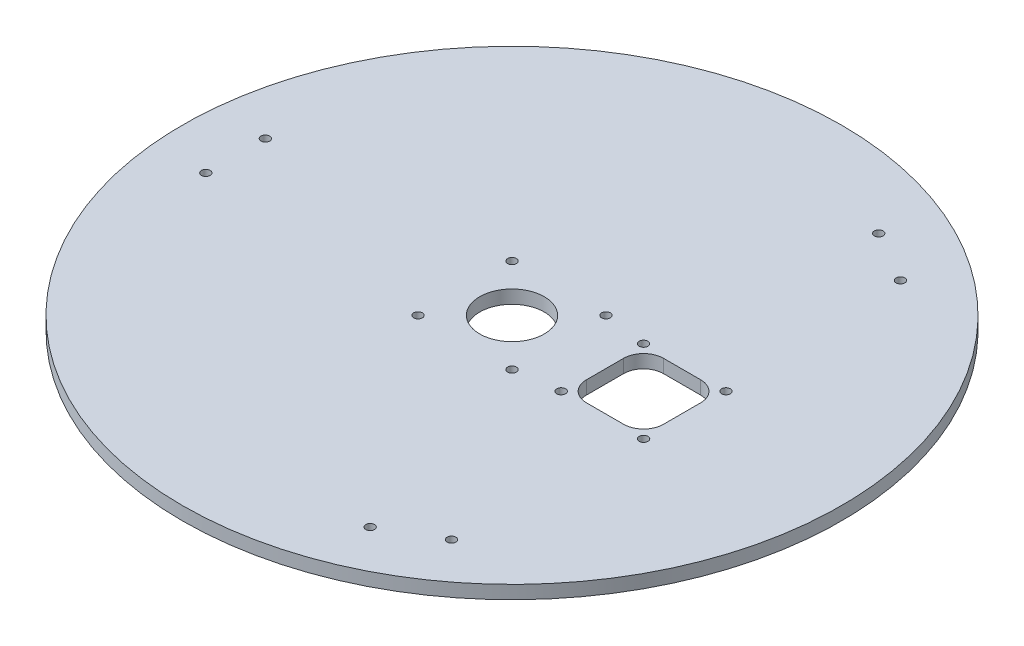
ISO-10303-21;
HEADER;
FILE_DESCRIPTION(('STEP AP214'),'2;1');
FILE_NAME('part.step','',(''),(''),'','','');
FILE_SCHEMA(('AUTOMOTIVE_DESIGN { 1 0 10303 214 1 1 1 1 }'));
ENDSEC;
DATA;
#1=APPLICATION_CONTEXT('core data for automotive mechanical design processes');
#2=APPLICATION_PROTOCOL_DEFINITION('international standard','automotive_design',2000,#1);
#3=PRODUCT_CONTEXT('',#1,'mechanical');
#4=PRODUCT('Part','Part','',(#3));
#5=PRODUCT_RELATED_PRODUCT_CATEGORY('part','',(#4));
#6=PRODUCT_DEFINITION_FORMATION('','',#4);
#7=PRODUCT_DEFINITION_CONTEXT('part definition',#1,'design');
#8=PRODUCT_DEFINITION('design','',#6,#7);
#9=PRODUCT_DEFINITION_SHAPE('','',#8);
#10=(LENGTH_UNIT() NAMED_UNIT(*) SI_UNIT(.MILLI.,.METRE.));
#11=(NAMED_UNIT(*) PLANE_ANGLE_UNIT() SI_UNIT($,.RADIAN.));
#12=(NAMED_UNIT(*) SI_UNIT($,.STERADIAN.) SOLID_ANGLE_UNIT());
#13=UNCERTAINTY_MEASURE_WITH_UNIT(LENGTH_MEASURE(1.E-05),#10,'distance_accuracy_value','');
#14=(GEOMETRIC_REPRESENTATION_CONTEXT(3) GLOBAL_UNCERTAINTY_ASSIGNED_CONTEXT((#13)) GLOBAL_UNIT_ASSIGNED_CONTEXT((#10,
#11,#12)) REPRESENTATION_CONTEXT('',''));
#15=CARTESIAN_POINT('',(0.,0.,0.));
#16=DIRECTION('',(0.,0.,1.));
#17=DIRECTION('',(1.,0.,0.));
#18=AXIS2_PLACEMENT_3D('',#15,#16,#17);
#19=CARTESIAN_POINT('',(-49.5,5.,0.));
#20=DIRECTION('',(0.,1.,0.));
#21=DIRECTION('',(0.,0.,1.));
#22=AXIS2_PLACEMENT_3D('',#19,#20,#21);
#23=PLANE('',#22);
#24=CARTESIAN_POINT('',(12.1994845223858,5.,84.4666419935816));
#25=DIRECTION('',(0.,1.,0.));
#26=DIRECTION('',(0.,0.,-1.));
#27=AXIS2_PLACEMENT_3D('',#24,#25,#26);
#28=CIRCLE('',#27,1.65000000000001);
#29=CARTESIAN_POINT('',(12.1994845223858,5.,82.8166419935816));
#30=VERTEX_POINT('',#29);
#31=EDGE_CURVE('E196',#30,#30,#28,.T.);
#32=ORIENTED_EDGE('',*,*,#31,.F.);
#33=EDGE_LOOP('',(#32));
#34=FACE_BOUND('',#33,.T.);
#35=CARTESIAN_POINT('',(-7.19948452238572,5.,-95.6666419935816));
#36=DIRECTION('',(0.,1.,0.));
#37=DIRECTION('',(0.,0.,-1.));
#38=AXIS2_PLACEMENT_3D('',#35,#36,#37);
#39=CIRCLE('',#38,1.65000000000003);
#40=CARTESIAN_POINT('',(-7.19948452238572,5.,-97.3166419935816));
#41=VERTEX_POINT('',#40);
#42=EDGE_CURVE('E200',#41,#41,#39,.T.);
#43=ORIENTED_EDGE('',*,*,#42,.F.);
#44=EDGE_LOOP('',(#43));
#45=FACE_BOUND('',#44,.T.);
#46=CARTESIAN_POINT('',(-153.5,5.,11.2));
#47=DIRECTION('',(0.,1.,0.));
#48=DIRECTION('',(0.,0.,-1.));
#49=AXIS2_PLACEMENT_3D('',#46,#47,#48);
#50=CIRCLE('',#49,1.65000000000002);
#51=CARTESIAN_POINT('',(-153.5,5.,9.54999999999998));
#52=VERTEX_POINT('',#51);
#53=EDGE_CURVE('E204',#52,#52,#50,.T.);
#54=ORIENTED_EDGE('',*,*,#53,.F.);
#55=EDGE_LOOP('',(#54));
#56=FACE_BOUND('',#55,.T.);
#57=CARTESIAN_POINT('',(15.5,5.,15.5));
#58=DIRECTION('',(0.,1.,0.));
#59=DIRECTION('',(0.,0.,-1.));
#60=AXIS2_PLACEMENT_3D('',#57,#58,#59);
#61=CIRCLE('',#60,1.65);
#62=CARTESIAN_POINT('',(15.5,5.,13.85));
#63=VERTEX_POINT('',#62);
#64=EDGE_CURVE('E208',#63,#63,#61,.T.);
#65=ORIENTED_EDGE('',*,*,#64,.F.);
#66=EDGE_LOOP('',(#65));
#67=FACE_BOUND('',#66,.T.);
#68=CARTESIAN_POINT('',(-15.5,5.,15.5));
#69=DIRECTION('',(0.,1.,0.));
#70=DIRECTION('',(0.,0.,1.));
#71=AXIS2_PLACEMENT_3D('',#68,#69,#70);
#72=CIRCLE('',#71,1.65);
#73=CARTESIAN_POINT('',(-15.5,5.,17.15));
#74=VERTEX_POINT('',#73);
#75=EDGE_CURVE('E212',#74,#74,#72,.T.);
#76=ORIENTED_EDGE('',*,*,#75,.F.);
#77=EDGE_LOOP('',(#76));
#78=FACE_BOUND('',#77,.T.);
#79=CARTESIAN_POINT('',(-49.5,5.,0.));
#80=DIRECTION('',(0.,1.,0.));
#81=DIRECTION('',(0.,0.,1.));
#82=AXIS2_PLACEMENT_3D('',#79,#80,#81);
#83=CIRCLE('',#82,12.15);
#84=CARTESIAN_POINT('',(-49.5,5.,12.15));
#85=VERTEX_POINT('',#84);
#86=EDGE_CURVE('E216',#85,#85,#83,.T.);
#87=ORIENTED_EDGE('',*,*,#86,.F.);
#88=EDGE_LOOP('',(#87));
#89=FACE_BOUND('',#88,.T.);
#90=CARTESIAN_POINT('',(-15.5,5.,-15.5));
#91=DIRECTION('',(0.,1.,0.));
#92=DIRECTION('',(0.,0.,-1.));
#93=AXIS2_PLACEMENT_3D('',#90,#91,#92);
#94=CIRCLE('',#93,1.65);
#95=CARTESIAN_POINT('',(-15.5,5.,-17.15));
#96=VERTEX_POINT('',#95);
#97=EDGE_CURVE('E138',#96,#96,#94,.T.);
#98=ORIENTED_EDGE('',*,*,#97,.F.);
#99=EDGE_LOOP('',(#98));
#100=FACE_BOUND('',#99,.T.);
#101=CARTESIAN_POINT('',(-49.5,5.,0.));
#102=DIRECTION('',(0.,1.,0.));
#103=DIRECTION('',(0.,0.,1.));
#104=AXIS2_PLACEMENT_3D('',#101,#102,#103);
#105=CIRCLE('',#104,124.);
#106=CARTESIAN_POINT('',(-49.5,5.,124.));
#107=VERTEX_POINT('',#106);
#108=EDGE_CURVE('E11',#107,#107,#105,.T.);
#109=ORIENTED_EDGE('',*,*,#108,.T.);
#110=EDGE_LOOP('',(#109));
#111=FACE_BOUND('',#110,.T.);
#112=CARTESIAN_POINT('',(15.5,5.,-15.5));
#113=DIRECTION('',(0.,1.,0.));
#114=DIRECTION('',(0.,0.,1.));
#115=AXIS2_PLACEMENT_3D('',#112,#113,#114);
#116=CIRCLE('',#115,1.65);
#117=CARTESIAN_POINT('',(15.5,5.,-13.85));
#118=VERTEX_POINT('',#117);
#119=EDGE_CURVE('E168',#118,#118,#116,.T.);
#120=ORIENTED_EDGE('',*,*,#119,.F.);
#121=EDGE_LOOP('',(#120));
#122=FACE_BOUND('',#121,.T.);
#123=DIRECTION('',(-1.,0.,0.));
#124=VECTOR('',#123,1.);
#125=CARTESIAN_POINT('',(-7.,5.,-14.5));
#126=LINE('',#125,#124);
#127=CARTESIAN_POINT('',(7.,5.,-14.5));
#128=VERTEX_POINT('',#127);
#129=CARTESIAN_POINT('',(-7.,5.,-14.5));
#130=VERTEX_POINT('',#129);
#131=EDGE_CURVE('E108',#128,#130,#126,.T.);
#132=ORIENTED_EDGE('',*,*,#131,.F.);
#133=CARTESIAN_POINT('',(7.,5.,-7.));
#134=DIRECTION('',(0.,1.,0.));
#135=DIRECTION('',(0.,0.,1.));
#136=AXIS2_PLACEMENT_3D('',#133,#134,#135);
#137=CIRCLE('',#136,7.5);
#138=CARTESIAN_POINT('',(14.5,5.,-7.));
#139=VERTEX_POINT('',#138);
#140=EDGE_CURVE('E100',#139,#128,#137,.T.);
#141=ORIENTED_EDGE('',*,*,#140,.F.);
#142=DIRECTION('',(0.,0.,-1.));
#143=VECTOR('',#142,1.);
#144=CARTESIAN_POINT('',(14.5,5.,7.));
#145=LINE('',#144,#143);
#146=CARTESIAN_POINT('',(14.5,5.,7.));
#147=VERTEX_POINT('',#146);
#148=EDGE_CURVE('E135',#147,#139,#145,.T.);
#149=ORIENTED_EDGE('',*,*,#148,.F.);
#150=CARTESIAN_POINT('',(7.,5.,7.));
#151=DIRECTION('',(0.,1.,0.));
#152=DIRECTION('',(0.,0.,-1.));
#153=AXIS2_PLACEMENT_3D('',#150,#151,#152);
#154=CIRCLE('',#153,7.5);
#155=CARTESIAN_POINT('',(7.,5.,14.5));
#156=VERTEX_POINT('',#155);
#157=EDGE_CURVE('E133',#156,#147,#154,.T.);
#158=ORIENTED_EDGE('',*,*,#157,.F.);
#159=DIRECTION('',(1.,0.,0.));
#160=VECTOR('',#159,1.);
#161=CARTESIAN_POINT('',(-7.,5.,14.5));
#162=LINE('',#161,#160);
#163=CARTESIAN_POINT('',(-7.,5.,14.5));
#164=VERTEX_POINT('',#163);
#165=EDGE_CURVE('E131',#164,#156,#162,.T.);
#166=ORIENTED_EDGE('',*,*,#165,.F.);
#167=CARTESIAN_POINT('',(-7.,5.,7.));
#168=DIRECTION('',(0.,1.,0.));
#169=DIRECTION('',(0.,0.,1.));
#170=AXIS2_PLACEMENT_3D('',#167,#168,#169);
#171=CIRCLE('',#170,7.5);
#172=CARTESIAN_POINT('',(-14.5,5.,7.));
#173=VERTEX_POINT('',#172);
#174=EDGE_CURVE('E129',#173,#164,#171,.T.);
#175=ORIENTED_EDGE('',*,*,#174,.F.);
#176=DIRECTION('',(0.,0.,1.));
#177=VECTOR('',#176,1.);
#178=CARTESIAN_POINT('',(-14.5,5.,7.));
#179=LINE('',#178,#177);
#180=CARTESIAN_POINT('',(-14.5,5.,-7.));
#181=VERTEX_POINT('',#180);
#182=EDGE_CURVE('E124',#181,#173,#179,.T.);
#183=ORIENTED_EDGE('',*,*,#182,.F.);
#184=CARTESIAN_POINT('',(-7.,5.,-7.));
#185=DIRECTION('',(0.,1.,0.));
#186=DIRECTION('',(0.,0.,-1.));
#187=AXIS2_PLACEMENT_3D('',#184,#185,#186);
#188=CIRCLE('',#187,7.5);
#189=EDGE_CURVE('E122',#130,#181,#188,.T.);
#190=ORIENTED_EDGE('',*,*,#189,.F.);
#191=EDGE_LOOP('',(#132,#141,#149,#158,#166,#175,#183,#190));
#192=FACE_BOUND('',#191,.T.);
#193=CARTESIAN_POINT('',(-31.8223304703363,5.,-17.6776695296637));
#194=DIRECTION('',(0.,1.,0.));
#195=DIRECTION('',(0.,0.,1.));
#196=AXIS2_PLACEMENT_3D('',#193,#194,#195);
#197=CIRCLE('',#196,1.65);
#198=CARTESIAN_POINT('',(-31.8223304703363,5.,-16.0276695296637));
#199=VERTEX_POINT('',#198);
#200=EDGE_CURVE('E321',#199,#199,#197,.T.);
#201=ORIENTED_EDGE('',*,*,#200,.F.);
#202=EDGE_LOOP('',(#201));
#203=FACE_BOUND('',#202,.T.);
#204=CARTESIAN_POINT('',(-67.1776695296637,5.,-17.6776695296637));
#205=DIRECTION('',(0.,1.,0.));
#206=DIRECTION('',(0.,0.,1.));
#207=AXIS2_PLACEMENT_3D('',#204,#205,#206);
#208=CIRCLE('',#207,1.65);
#209=CARTESIAN_POINT('',(-67.1776695296637,5.,-16.0276695296637));
#210=VERTEX_POINT('',#209);
#211=EDGE_CURVE('E315',#210,#210,#208,.T.);
#212=ORIENTED_EDGE('',*,*,#211,.F.);
#213=EDGE_LOOP('',(#212));
#214=FACE_BOUND('',#213,.T.);
#215=CARTESIAN_POINT('',(-67.1776695296637,5.,17.6776695296637));
#216=DIRECTION('',(0.,1.,0.));
#217=DIRECTION('',(0.,0.,1.));
#218=AXIS2_PLACEMENT_3D('',#215,#216,#217);
#219=CIRCLE('',#218,1.64999999999999);
#220=CARTESIAN_POINT('',(-67.1776695296637,5.,19.3276695296636));
#221=VERTEX_POINT('',#220);
#222=EDGE_CURVE('E309',#221,#221,#219,.T.);
#223=ORIENTED_EDGE('',*,*,#222,.F.);
#224=EDGE_LOOP('',(#223));
#225=FACE_BOUND('',#224,.T.);
#226=CARTESIAN_POINT('',(-31.8223304703363,5.,17.6776695296636));
#227=DIRECTION('',(0.,1.,0.));
#228=DIRECTION('',(0.,0.,1.));
#229=AXIS2_PLACEMENT_3D('',#226,#227,#228);
#230=CIRCLE('',#229,1.65000000000005);
#231=CARTESIAN_POINT('',(-31.8223304703363,5.,19.3276695296637));
#232=VERTEX_POINT('',#231);
#233=EDGE_CURVE('E303',#232,#232,#230,.T.);
#234=ORIENTED_EDGE('',*,*,#233,.F.);
#235=EDGE_LOOP('',(#234));
#236=FACE_BOUND('',#235,.T.);
#237=CARTESIAN_POINT('',(-153.5,5.,-11.2));
#238=DIRECTION('',(0.,1.,0.));
#239=DIRECTION('',(0.,0.,1.));
#240=AXIS2_PLACEMENT_3D('',#237,#238,#239);
#241=CIRCLE('',#240,1.65000000000002);
#242=CARTESIAN_POINT('',(-153.5,5.,-9.54999999999995));
#243=VERTEX_POINT('',#242);
#244=EDGE_CURVE('E297',#243,#243,#241,.T.);
#245=ORIENTED_EDGE('',*,*,#244,.F.);
#246=EDGE_LOOP('',(#245));
#247=FACE_BOUND('',#246,.T.);
#248=CARTESIAN_POINT('',(12.1994845223857,5.,-84.4666419935817));
#249=DIRECTION('',(0.,1.,0.));
#250=DIRECTION('',(0.,0.,1.));
#251=AXIS2_PLACEMENT_3D('',#248,#249,#250);
#252=CIRCLE('',#251,1.65000000000003);
#253=CARTESIAN_POINT('',(12.1994845223857,5.,-82.8166419935816));
#254=VERTEX_POINT('',#253);
#255=EDGE_CURVE('E291',#254,#254,#252,.T.);
#256=ORIENTED_EDGE('',*,*,#255,.F.);
#257=EDGE_LOOP('',(#256));
#258=FACE_BOUND('',#257,.T.);
#259=CARTESIAN_POINT('',(-7.19948452238563,5.,95.6666419935816));
#260=DIRECTION('',(0.,1.,0.));
#261=DIRECTION('',(0.,0.,1.));
#262=AXIS2_PLACEMENT_3D('',#259,#260,#261);
#263=CIRCLE('',#262,1.65000000000001);
#264=CARTESIAN_POINT('',(-7.19948452238563,5.,97.3166419935816));
#265=VERTEX_POINT('',#264);
#266=EDGE_CURVE('E284',#265,#265,#263,.T.);
#267=ORIENTED_EDGE('',*,*,#266,.F.);
#268=EDGE_LOOP('',(#267));
#269=FACE_BOUND('',#268,.T.);
#270=ADVANCED_FACE('F35',(#34,#45,#56,#67,#78,#89,#100,#111,#122,#192,#203,#214,#225,#236,#247,
#258,#269),#23,.T.);
#271=CARTESIAN_POINT('',(-49.5,0.,0.));
#272=DIRECTION('',(0.,1.,0.));
#273=DIRECTION('',(0.,0.,1.));
#274=AXIS2_PLACEMENT_3D('',#271,#272,#273);
#275=PLANE('',#274);
#276=CARTESIAN_POINT('',(15.5,0.,-15.5));
#277=DIRECTION('',(0.,1.,0.));
#278=DIRECTION('',(0.,0.,1.));
#279=AXIS2_PLACEMENT_3D('',#276,#277,#278);
#280=CIRCLE('',#279,1.65);
#281=CARTESIAN_POINT('',(15.5,0.,-13.85));
#282=VERTEX_POINT('',#281);
#283=EDGE_CURVE('E116',#282,#282,#280,.T.);
#284=ORIENTED_EDGE('',*,*,#283,.T.);
#285=EDGE_LOOP('',(#284));
#286=FACE_BOUND('',#285,.T.);
#287=CARTESIAN_POINT('',(-49.5,0.,0.));
#288=DIRECTION('',(0.,1.,0.));
#289=DIRECTION('',(0.,0.,1.));
#290=AXIS2_PLACEMENT_3D('',#287,#288,#289);
#291=CIRCLE('',#290,124.);
#292=CARTESIAN_POINT('',(-49.5,0.,124.));
#293=VERTEX_POINT('',#292);
#294=EDGE_CURVE('E39',#293,#293,#291,.T.);
#295=ORIENTED_EDGE('',*,*,#294,.F.);
#296=EDGE_LOOP('',(#295));
#297=FACE_BOUND('',#296,.T.);
#298=CARTESIAN_POINT('',(7.,0.,-7.));
#299=DIRECTION('',(0.,1.,0.));
#300=DIRECTION('',(0.,0.,1.));
#301=AXIS2_PLACEMENT_3D('',#298,#299,#300);
#302=CIRCLE('',#301,7.5);
#303=CARTESIAN_POINT('',(14.5,0.,-7.));
#304=VERTEX_POINT('',#303);
#305=CARTESIAN_POINT('',(7.,0.,-14.5));
#306=VERTEX_POINT('',#305);
#307=EDGE_CURVE('E58',#304,#306,#302,.T.);
#308=ORIENTED_EDGE('',*,*,#307,.T.);
#309=DIRECTION('',(-1.,0.,0.));
#310=VECTOR('',#309,1.);
#311=CARTESIAN_POINT('',(-7.,0.,-14.5));
#312=LINE('',#311,#310);
#313=CARTESIAN_POINT('',(-7.,0.,-14.5));
#314=VERTEX_POINT('',#313);
#315=EDGE_CURVE('E115',#306,#314,#312,.T.);
#316=ORIENTED_EDGE('',*,*,#315,.T.);
#317=CARTESIAN_POINT('',(-7.,0.,-7.));
#318=DIRECTION('',(0.,1.,0.));
#319=DIRECTION('',(0.,0.,-1.));
#320=AXIS2_PLACEMENT_3D('',#317,#318,#319);
#321=CIRCLE('',#320,7.5);
#322=CARTESIAN_POINT('',(-14.5,0.,-7.));
#323=VERTEX_POINT('',#322);
#324=EDGE_CURVE('E140',#314,#323,#321,.T.);
#325=ORIENTED_EDGE('',*,*,#324,.T.);
#326=DIRECTION('',(0.,0.,1.));
#327=VECTOR('',#326,1.);
#328=CARTESIAN_POINT('',(-14.5,0.,7.));
#329=LINE('',#328,#327);
#330=CARTESIAN_POINT('',(-14.5,0.,7.));
#331=VERTEX_POINT('',#330);
#332=EDGE_CURVE('E143',#323,#331,#329,.T.);
#333=ORIENTED_EDGE('',*,*,#332,.T.);
#334=CARTESIAN_POINT('',(-7.,0.,7.));
#335=DIRECTION('',(0.,1.,0.));
#336=DIRECTION('',(0.,0.,1.));
#337=AXIS2_PLACEMENT_3D('',#334,#335,#336);
#338=CIRCLE('',#337,7.5);
#339=CARTESIAN_POINT('',(-7.,0.,14.5));
#340=VERTEX_POINT('',#339);
#341=EDGE_CURVE('E146',#331,#340,#338,.T.);
#342=ORIENTED_EDGE('',*,*,#341,.T.);
#343=DIRECTION('',(1.,0.,0.));
#344=VECTOR('',#343,1.);
#345=CARTESIAN_POINT('',(-7.,0.,14.5));
#346=LINE('',#345,#344);
#347=CARTESIAN_POINT('',(7.,0.,14.5));
#348=VERTEX_POINT('',#347);
#349=EDGE_CURVE('E149',#340,#348,#346,.T.);
#350=ORIENTED_EDGE('',*,*,#349,.T.);
#351=CARTESIAN_POINT('',(7.,0.,7.));
#352=DIRECTION('',(0.,1.,0.));
#353=DIRECTION('',(0.,0.,-1.));
#354=AXIS2_PLACEMENT_3D('',#351,#352,#353);
#355=CIRCLE('',#354,7.5);
#356=CARTESIAN_POINT('',(14.5,0.,7.));
#357=VERTEX_POINT('',#356);
#358=EDGE_CURVE('E152',#348,#357,#355,.T.);
#359=ORIENTED_EDGE('',*,*,#358,.T.);
#360=DIRECTION('',(0.,0.,-1.));
#361=VECTOR('',#360,1.);
#362=CARTESIAN_POINT('',(14.5,0.,7.));
#363=LINE('',#362,#361);
#364=EDGE_CURVE('E109',#357,#304,#363,.T.);
#365=ORIENTED_EDGE('',*,*,#364,.T.);
#366=EDGE_LOOP('',(#308,#316,#325,#333,#342,#350,#359,#365));
#367=FACE_BOUND('',#366,.T.);
#368=CARTESIAN_POINT('',(-15.5,0.,-15.5));
#369=DIRECTION('',(0.,1.,0.));
#370=DIRECTION('',(0.,0.,-1.));
#371=AXIS2_PLACEMENT_3D('',#368,#369,#370);
#372=CIRCLE('',#371,1.65);
#373=CARTESIAN_POINT('',(-15.5,0.,-17.15));
#374=VERTEX_POINT('',#373);
#375=EDGE_CURVE('E231',#374,#374,#372,.T.);
#376=ORIENTED_EDGE('',*,*,#375,.T.);
#377=EDGE_LOOP('',(#376));
#378=FACE_BOUND('',#377,.T.);
#379=CARTESIAN_POINT('',(-31.8223304703363,0.,-17.6776695296637));
#380=DIRECTION('',(0.,1.,0.));
#381=DIRECTION('',(0.,0.,1.));
#382=AXIS2_PLACEMENT_3D('',#379,#380,#381);
#383=CIRCLE('',#382,1.65);
#384=CARTESIAN_POINT('',(-31.8223304703363,0.,-16.0276695296637));
#385=VERTEX_POINT('',#384);
#386=EDGE_CURVE('E235',#385,#385,#383,.T.);
#387=ORIENTED_EDGE('',*,*,#386,.T.);
#388=EDGE_LOOP('',(#387));
#389=FACE_BOUND('',#388,.T.);
#390=CARTESIAN_POINT('',(-49.5,0.,0.));
#391=DIRECTION('',(0.,1.,0.));
#392=DIRECTION('',(0.,0.,1.));
#393=AXIS2_PLACEMENT_3D('',#390,#391,#392);
#394=CIRCLE('',#393,12.15);
#395=CARTESIAN_POINT('',(-49.5,0.,12.15));
#396=VERTEX_POINT('',#395);
#397=EDGE_CURVE('E239',#396,#396,#394,.T.);
#398=ORIENTED_EDGE('',*,*,#397,.T.);
#399=EDGE_LOOP('',(#398));
#400=FACE_BOUND('',#399,.T.);
#401=CARTESIAN_POINT('',(-67.1776695296637,0.,-17.6776695296637));
#402=DIRECTION('',(0.,1.,0.));
#403=DIRECTION('',(0.,0.,1.));
#404=AXIS2_PLACEMENT_3D('',#401,#402,#403);
#405=CIRCLE('',#404,1.65);
#406=CARTESIAN_POINT('',(-67.1776695296637,0.,-16.0276695296637));
#407=VERTEX_POINT('',#406);
#408=EDGE_CURVE('E243',#407,#407,#405,.T.);
#409=ORIENTED_EDGE('',*,*,#408,.T.);
#410=EDGE_LOOP('',(#409));
#411=FACE_BOUND('',#410,.T.);
#412=CARTESIAN_POINT('',(-15.5,0.,15.5));
#413=DIRECTION('',(0.,1.,0.));
#414=DIRECTION('',(0.,0.,1.));
#415=AXIS2_PLACEMENT_3D('',#412,#413,#414);
#416=CIRCLE('',#415,1.65);
#417=CARTESIAN_POINT('',(-15.5,0.,17.15));
#418=VERTEX_POINT('',#417);
#419=EDGE_CURVE('E247',#418,#418,#416,.T.);
#420=ORIENTED_EDGE('',*,*,#419,.T.);
#421=EDGE_LOOP('',(#420));
#422=FACE_BOUND('',#421,.T.);
#423=CARTESIAN_POINT('',(-67.1776695296637,0.,17.6776695296637));
#424=DIRECTION('',(0.,1.,0.));
#425=DIRECTION('',(0.,0.,1.));
#426=AXIS2_PLACEMENT_3D('',#423,#424,#425);
#427=CIRCLE('',#426,1.64999999999999);
#428=CARTESIAN_POINT('',(-67.1776695296637,0.,19.3276695296636));
#429=VERTEX_POINT('',#428);
#430=EDGE_CURVE('E251',#429,#429,#427,.T.);
#431=ORIENTED_EDGE('',*,*,#430,.T.);
#432=EDGE_LOOP('',(#431));
#433=FACE_BOUND('',#432,.T.);
#434=CARTESIAN_POINT('',(15.5,0.,15.5));
#435=DIRECTION('',(0.,1.,0.));
#436=DIRECTION('',(0.,0.,-1.));
#437=AXIS2_PLACEMENT_3D('',#434,#435,#436);
#438=CIRCLE('',#437,1.65);
#439=CARTESIAN_POINT('',(15.5,0.,13.85));
#440=VERTEX_POINT('',#439);
#441=EDGE_CURVE('E255',#440,#440,#438,.T.);
#442=ORIENTED_EDGE('',*,*,#441,.T.);
#443=EDGE_LOOP('',(#442));
#444=FACE_BOUND('',#443,.T.);
#445=CARTESIAN_POINT('',(-31.8223304703363,0.,17.6776695296636));
#446=DIRECTION('',(0.,1.,0.));
#447=DIRECTION('',(0.,0.,1.));
#448=AXIS2_PLACEMENT_3D('',#445,#446,#447);
#449=CIRCLE('',#448,1.65000000000005);
#450=CARTESIAN_POINT('',(-31.8223304703363,0.,19.3276695296637));
#451=VERTEX_POINT('',#450);
#452=EDGE_CURVE('E259',#451,#451,#449,.T.);
#453=ORIENTED_EDGE('',*,*,#452,.T.);
#454=EDGE_LOOP('',(#453));
#455=FACE_BOUND('',#454,.T.);
#456=CARTESIAN_POINT('',(-153.5,0.,11.2));
#457=DIRECTION('',(0.,1.,0.));
#458=DIRECTION('',(0.,0.,-1.));
#459=AXIS2_PLACEMENT_3D('',#456,#457,#458);
#460=CIRCLE('',#459,1.65000000000002);
#461=CARTESIAN_POINT('',(-153.5,0.,9.54999999999998));
#462=VERTEX_POINT('',#461);
#463=EDGE_CURVE('E263',#462,#462,#460,.T.);
#464=ORIENTED_EDGE('',*,*,#463,.T.);
#465=EDGE_LOOP('',(#464));
#466=FACE_BOUND('',#465,.T.);
#467=CARTESIAN_POINT('',(-153.5,0.,-11.2));
#468=DIRECTION('',(0.,1.,0.));
#469=DIRECTION('',(0.,0.,1.));
#470=AXIS2_PLACEMENT_3D('',#467,#468,#469);
#471=CIRCLE('',#470,1.65000000000002);
#472=CARTESIAN_POINT('',(-153.5,0.,-9.54999999999995));
#473=VERTEX_POINT('',#472);
#474=EDGE_CURVE('E267',#473,#473,#471,.T.);
#475=ORIENTED_EDGE('',*,*,#474,.T.);
#476=EDGE_LOOP('',(#475));
#477=FACE_BOUND('',#476,.T.);
#478=CARTESIAN_POINT('',(-7.19948452238572,0.,-95.6666419935816));
#479=DIRECTION('',(0.,1.,0.));
#480=DIRECTION('',(0.,0.,-1.));
#481=AXIS2_PLACEMENT_3D('',#478,#479,#480);
#482=CIRCLE('',#481,1.65000000000003);
#483=CARTESIAN_POINT('',(-7.19948452238572,0.,-97.3166419935816));
#484=VERTEX_POINT('',#483);
#485=EDGE_CURVE('E271',#484,#484,#482,.T.);
#486=ORIENTED_EDGE('',*,*,#485,.T.);
#487=EDGE_LOOP('',(#486));
#488=FACE_BOUND('',#487,.T.);
#489=CARTESIAN_POINT('',(12.1994845223857,0.,-84.4666419935817));
#490=DIRECTION('',(0.,1.,0.));
#491=DIRECTION('',(0.,0.,1.));
#492=AXIS2_PLACEMENT_3D('',#489,#490,#491);
#493=CIRCLE('',#492,1.65000000000003);
#494=CARTESIAN_POINT('',(12.1994845223857,0.,-82.8166419935816));
#495=VERTEX_POINT('',#494);
#496=EDGE_CURVE('E275',#495,#495,#493,.T.);
#497=ORIENTED_EDGE('',*,*,#496,.T.);
#498=EDGE_LOOP('',(#497));
#499=FACE_BOUND('',#498,.T.);
#500=CARTESIAN_POINT('',(12.1994845223858,0.,84.4666419935816));
#501=DIRECTION('',(0.,1.,0.));
#502=DIRECTION('',(0.,0.,-1.));
#503=AXIS2_PLACEMENT_3D('',#500,#501,#502);
#504=CIRCLE('',#503,1.65000000000001);
#505=CARTESIAN_POINT('',(12.1994845223858,0.,82.8166419935816));
#506=VERTEX_POINT('',#505);
#507=EDGE_CURVE('E279',#506,#506,#504,.T.);
#508=ORIENTED_EDGE('',*,*,#507,.T.);
#509=EDGE_LOOP('',(#508));
#510=FACE_BOUND('',#509,.T.);
#511=CARTESIAN_POINT('',(-7.19948452238563,0.,95.6666419935816));
#512=DIRECTION('',(0.,1.,0.));
#513=DIRECTION('',(0.,0.,1.));
#514=AXIS2_PLACEMENT_3D('',#511,#512,#513);
#515=CIRCLE('',#514,1.65000000000001);
#516=CARTESIAN_POINT('',(-7.19948452238563,0.,97.3166419935816));
#517=VERTEX_POINT('',#516);
#518=EDGE_CURVE('E282',#517,#517,#515,.T.);
#519=ORIENTED_EDGE('',*,*,#518,.T.);
#520=EDGE_LOOP('',(#519));
#521=FACE_BOUND('',#520,.T.);
#522=ADVANCED_FACE('F174',(#286,#297,#367,#378,#389,#400,#411,#422,#433,#444,#455,#466,#477,
#488,#499,#510,#521),#275,.F.);
#523=CARTESIAN_POINT('',(-49.5,5.,0.));
#524=DIRECTION('',(0.,-1.,0.));
#525=DIRECTION('',(0.,0.,-1.));
#526=AXIS2_PLACEMENT_3D('',#523,#524,#525);
#527=CYLINDRICAL_SURFACE('',#526,124.);
#528=ORIENTED_EDGE('',*,*,#108,.F.);
#529=EDGE_LOOP('',(#528));
#530=FACE_BOUND('',#529,.T.);
#531=ORIENTED_EDGE('',*,*,#294,.T.);
#532=EDGE_LOOP('',(#531));
#533=FACE_BOUND('',#532,.T.);
#534=ADVANCED_FACE('F37',(#530,#533),#527,.T.);
#535=CARTESIAN_POINT('',(15.5,5.,-15.5));
#536=DIRECTION('',(0.,-1.,0.));
#537=DIRECTION('',(0.,0.,-1.));
#538=AXIS2_PLACEMENT_3D('',#535,#536,#537);
#539=CYLINDRICAL_SURFACE('',#538,1.65);
#540=ORIENTED_EDGE('',*,*,#119,.T.);
#541=EDGE_LOOP('',(#540));
#542=FACE_BOUND('',#541,.T.);
#543=ORIENTED_EDGE('',*,*,#283,.F.);
#544=EDGE_LOOP('',(#543));
#545=FACE_BOUND('',#544,.T.);
#546=ADVANCED_FACE('F177',(#542,#545),#539,.F.);
#547=CARTESIAN_POINT('',(7.,5.,-7.));
#548=DIRECTION('',(0.,-1.,0.));
#549=DIRECTION('',(0.,0.,-1.));
#550=AXIS2_PLACEMENT_3D('',#547,#548,#549);
#551=CYLINDRICAL_SURFACE('',#550,7.5);
#552=ORIENTED_EDGE('',*,*,#307,.F.);
#553=DIRECTION('',(0.,-1.,0.));
#554=VECTOR('',#553,1.);
#555=CARTESIAN_POINT('',(14.5,5.,-7.));
#556=LINE('',#555,#554);
#557=EDGE_CURVE('E104',#139,#304,#556,.T.);
#558=ORIENTED_EDGE('',*,*,#557,.F.);
#559=ORIENTED_EDGE('',*,*,#140,.T.);
#560=DIRECTION('',(0.,-1.,0.));
#561=VECTOR('',#560,1.);
#562=CARTESIAN_POINT('',(7.,5.,-14.5));
#563=LINE('',#562,#561);
#564=EDGE_CURVE('E103',#128,#306,#563,.T.);
#565=ORIENTED_EDGE('',*,*,#564,.T.);
#566=EDGE_LOOP('',(#552,#558,#559,#565));
#567=FACE_BOUND('',#566,.T.);
#568=ADVANCED_FACE('F102',(#567),#551,.F.);
#569=CARTESIAN_POINT('',(-7.,5.,-14.5));
#570=DIRECTION('',(0.,0.,1.));
#571=DIRECTION('',(1.,0.,0.));
#572=AXIS2_PLACEMENT_3D('',#569,#570,#571);
#573=PLANE('',#572);
#574=ORIENTED_EDGE('',*,*,#315,.F.);
#575=ORIENTED_EDGE('',*,*,#564,.F.);
#576=ORIENTED_EDGE('',*,*,#131,.T.);
#577=DIRECTION('',(0.,-1.,0.));
#578=VECTOR('',#577,1.);
#579=CARTESIAN_POINT('',(-7.,5.,-14.5));
#580=LINE('',#579,#578);
#581=EDGE_CURVE('E117',#130,#314,#580,.T.);
#582=ORIENTED_EDGE('',*,*,#581,.T.);
#583=EDGE_LOOP('',(#574,#575,#576,#582));
#584=FACE_BOUND('',#583,.T.);
#585=ADVANCED_FACE('F112',(#584),#573,.T.);
#586=CARTESIAN_POINT('',(-7.,5.,-7.));
#587=DIRECTION('',(0.,-1.,0.));
#588=DIRECTION('',(0.,0.,-1.));
#589=AXIS2_PLACEMENT_3D('',#586,#587,#588);
#590=CYLINDRICAL_SURFACE('',#589,7.5);
#591=ORIENTED_EDGE('',*,*,#324,.F.);
#592=ORIENTED_EDGE('',*,*,#581,.F.);
#593=ORIENTED_EDGE('',*,*,#189,.T.);
#594=DIRECTION('',(0.,-1.,0.));
#595=VECTOR('',#594,1.);
#596=CARTESIAN_POINT('',(-14.5,5.,-7.));
#597=LINE('',#596,#595);
#598=EDGE_CURVE('E165',#181,#323,#597,.T.);
#599=ORIENTED_EDGE('',*,*,#598,.T.);
#600=EDGE_LOOP('',(#591,#592,#593,#599));
#601=FACE_BOUND('',#600,.T.);
#602=ADVANCED_FACE('F357',(#601),#590,.F.);
#603=CARTESIAN_POINT('',(-14.5,5.,7.));
#604=DIRECTION('',(1.,0.,0.));
#605=DIRECTION('',(0.,0.,-1.));
#606=AXIS2_PLACEMENT_3D('',#603,#604,#605);
#607=PLANE('',#606);
#608=ORIENTED_EDGE('',*,*,#332,.F.);
#609=ORIENTED_EDGE('',*,*,#598,.F.);
#610=ORIENTED_EDGE('',*,*,#182,.T.);
#611=DIRECTION('',(0.,-1.,0.));
#612=VECTOR('',#611,1.);
#613=CARTESIAN_POINT('',(-14.5,5.,7.));
#614=LINE('',#613,#612);
#615=EDGE_CURVE('E163',#173,#331,#614,.T.);
#616=ORIENTED_EDGE('',*,*,#615,.T.);
#617=EDGE_LOOP('',(#608,#609,#610,#616));
#618=FACE_BOUND('',#617,.T.);
#619=ADVANCED_FACE('F353',(#618),#607,.T.);
#620=CARTESIAN_POINT('',(-7.,5.,7.));
#621=DIRECTION('',(0.,-1.,0.));
#622=DIRECTION('',(0.,0.,-1.));
#623=AXIS2_PLACEMENT_3D('',#620,#621,#622);
#624=CYLINDRICAL_SURFACE('',#623,7.5);
#625=ORIENTED_EDGE('',*,*,#341,.F.);
#626=ORIENTED_EDGE('',*,*,#615,.F.);
#627=ORIENTED_EDGE('',*,*,#174,.T.);
#628=DIRECTION('',(0.,-1.,0.));
#629=VECTOR('',#628,1.);
#630=CARTESIAN_POINT('',(-7.,5.,14.5));
#631=LINE('',#630,#629);
#632=EDGE_CURVE('E161',#164,#340,#631,.T.);
#633=ORIENTED_EDGE('',*,*,#632,.T.);
#634=EDGE_LOOP('',(#625,#626,#627,#633));
#635=FACE_BOUND('',#634,.T.);
#636=ADVANCED_FACE('F349',(#635),#624,.F.);
#637=CARTESIAN_POINT('',(-7.,5.,14.5));
#638=DIRECTION('',(0.,0.,-1.));
#639=DIRECTION('',(-1.,0.,0.));
#640=AXIS2_PLACEMENT_3D('',#637,#638,#639);
#641=PLANE('',#640);
#642=ORIENTED_EDGE('',*,*,#349,.F.);
#643=ORIENTED_EDGE('',*,*,#632,.F.);
#644=ORIENTED_EDGE('',*,*,#165,.T.);
#645=DIRECTION('',(0.,-1.,0.));
#646=VECTOR('',#645,1.);
#647=CARTESIAN_POINT('',(7.,5.,14.5));
#648=LINE('',#647,#646);
#649=EDGE_CURVE('E159',#156,#348,#648,.T.);
#650=ORIENTED_EDGE('',*,*,#649,.T.);
#651=EDGE_LOOP('',(#642,#643,#644,#650));
#652=FACE_BOUND('',#651,.T.);
#653=ADVANCED_FACE('F345',(#652),#641,.T.);
#654=CARTESIAN_POINT('',(7.,5.,7.));
#655=DIRECTION('',(0.,-1.,0.));
#656=DIRECTION('',(0.,0.,-1.));
#657=AXIS2_PLACEMENT_3D('',#654,#655,#656);
#658=CYLINDRICAL_SURFACE('',#657,7.5);
#659=ORIENTED_EDGE('',*,*,#358,.F.);
#660=ORIENTED_EDGE('',*,*,#649,.F.);
#661=ORIENTED_EDGE('',*,*,#157,.T.);
#662=DIRECTION('',(0.,-1.,0.));
#663=VECTOR('',#662,1.);
#664=CARTESIAN_POINT('',(14.5,5.,7.));
#665=LINE('',#664,#663);
#666=EDGE_CURVE('E50',#147,#357,#665,.T.);
#667=ORIENTED_EDGE('',*,*,#666,.T.);
#668=EDGE_LOOP('',(#659,#660,#661,#667));
#669=FACE_BOUND('',#668,.T.);
#670=ADVANCED_FACE('F339',(#669),#658,.F.);
#671=CARTESIAN_POINT('',(14.5,5.,7.));
#672=DIRECTION('',(-1.,0.,0.));
#673=DIRECTION('',(0.,0.,1.));
#674=AXIS2_PLACEMENT_3D('',#671,#672,#673);
#675=PLANE('',#674);
#676=ORIENTED_EDGE('',*,*,#364,.F.);
#677=ORIENTED_EDGE('',*,*,#666,.F.);
#678=ORIENTED_EDGE('',*,*,#148,.T.);
#679=ORIENTED_EDGE('',*,*,#557,.T.);
#680=EDGE_LOOP('',(#676,#677,#678,#679));
#681=FACE_BOUND('',#680,.T.);
#682=ADVANCED_FACE('F330',(#681),#675,.T.);
#683=CARTESIAN_POINT('',(-15.5,5.,-15.5));
#684=DIRECTION('',(0.,-1.,0.));
#685=DIRECTION('',(0.,0.,-1.));
#686=AXIS2_PLACEMENT_3D('',#683,#684,#685);
#687=CYLINDRICAL_SURFACE('',#686,1.65);
#688=ORIENTED_EDGE('',*,*,#97,.T.);
#689=EDGE_LOOP('',(#688));
#690=FACE_BOUND('',#689,.T.);
#691=ORIENTED_EDGE('',*,*,#375,.F.);
#692=EDGE_LOOP('',(#691));
#693=FACE_BOUND('',#692,.T.);
#694=ADVANCED_FACE('F326',(#690,#693),#687,.F.);
#695=CARTESIAN_POINT('',(-31.8223304703363,5.,-17.6776695296637));
#696=DIRECTION('',(0.,-1.,0.));
#697=DIRECTION('',(0.,0.,-1.));
#698=AXIS2_PLACEMENT_3D('',#695,#696,#697);
#699=CYLINDRICAL_SURFACE('',#698,1.65);
#700=ORIENTED_EDGE('',*,*,#200,.T.);
#701=EDGE_LOOP('',(#700));
#702=FACE_BOUND('',#701,.T.);
#703=ORIENTED_EDGE('',*,*,#386,.F.);
#704=EDGE_LOOP('',(#703));
#705=FACE_BOUND('',#704,.T.);
#706=ADVANCED_FACE('F329',(#702,#705),#699,.F.);
#707=CARTESIAN_POINT('',(-49.5,5.,0.));
#708=DIRECTION('',(0.,-1.,0.));
#709=DIRECTION('',(0.,0.,-1.));
#710=AXIS2_PLACEMENT_3D('',#707,#708,#709);
#711=CYLINDRICAL_SURFACE('',#710,12.15);
#712=ORIENTED_EDGE('',*,*,#86,.T.);
#713=EDGE_LOOP('',(#712));
#714=FACE_BOUND('',#713,.T.);
#715=ORIENTED_EDGE('',*,*,#397,.F.);
#716=EDGE_LOOP('',(#715));
#717=FACE_BOUND('',#716,.T.);
#718=ADVANCED_FACE('F336',(#714,#717),#711,.F.);
#719=CARTESIAN_POINT('',(-67.1776695296637,5.,-17.6776695296637));
#720=DIRECTION('',(0.,-1.,0.));
#721=DIRECTION('',(0.,0.,-1.));
#722=AXIS2_PLACEMENT_3D('',#719,#720,#721);
#723=CYLINDRICAL_SURFACE('',#722,1.65);
#724=ORIENTED_EDGE('',*,*,#211,.T.);
#725=EDGE_LOOP('',(#724));
#726=FACE_BOUND('',#725,.T.);
#727=ORIENTED_EDGE('',*,*,#408,.F.);
#728=EDGE_LOOP('',(#727));
#729=FACE_BOUND('',#728,.T.);
#730=ADVANCED_FACE('F410',(#726,#729),#723,.F.);
#731=CARTESIAN_POINT('',(-15.5,5.,15.5));
#732=DIRECTION('',(0.,-1.,0.));
#733=DIRECTION('',(0.,0.,-1.));
#734=AXIS2_PLACEMENT_3D('',#731,#732,#733);
#735=CYLINDRICAL_SURFACE('',#734,1.65);
#736=ORIENTED_EDGE('',*,*,#75,.T.);
#737=EDGE_LOOP('',(#736));
#738=FACE_BOUND('',#737,.T.);
#739=ORIENTED_EDGE('',*,*,#419,.F.);
#740=EDGE_LOOP('',(#739));
#741=FACE_BOUND('',#740,.T.);
#742=ADVANCED_FACE('F419',(#738,#741),#735,.F.);
#743=CARTESIAN_POINT('',(-67.1776695296637,5.,17.6776695296637));
#744=DIRECTION('',(0.,-1.,0.));
#745=DIRECTION('',(0.,0.,-1.));
#746=AXIS2_PLACEMENT_3D('',#743,#744,#745);
#747=CYLINDRICAL_SURFACE('',#746,1.64999999999999);
#748=ORIENTED_EDGE('',*,*,#222,.T.);
#749=EDGE_LOOP('',(#748));
#750=FACE_BOUND('',#749,.T.);
#751=ORIENTED_EDGE('',*,*,#430,.F.);
#752=EDGE_LOOP('',(#751));
#753=FACE_BOUND('',#752,.T.);
#754=ADVANCED_FACE('F429',(#750,#753),#747,.F.);
#755=CARTESIAN_POINT('',(15.5,5.,15.5));
#756=DIRECTION('',(0.,-1.,0.));
#757=DIRECTION('',(0.,0.,-1.));
#758=AXIS2_PLACEMENT_3D('',#755,#756,#757);
#759=CYLINDRICAL_SURFACE('',#758,1.65);
#760=ORIENTED_EDGE('',*,*,#64,.T.);
#761=EDGE_LOOP('',(#760));
#762=FACE_BOUND('',#761,.T.);
#763=ORIENTED_EDGE('',*,*,#441,.F.);
#764=EDGE_LOOP('',(#763));
#765=FACE_BOUND('',#764,.T.);
#766=ADVANCED_FACE('F439',(#762,#765),#759,.F.);
#767=CARTESIAN_POINT('',(-31.8223304703363,5.,17.6776695296636));
#768=DIRECTION('',(0.,-1.,0.));
#769=DIRECTION('',(0.,0.,-1.));
#770=AXIS2_PLACEMENT_3D('',#767,#768,#769);
#771=CYLINDRICAL_SURFACE('',#770,1.65000000000005);
#772=ORIENTED_EDGE('',*,*,#233,.T.);
#773=EDGE_LOOP('',(#772));
#774=FACE_BOUND('',#773,.T.);
#775=ORIENTED_EDGE('',*,*,#452,.F.);
#776=EDGE_LOOP('',(#775));
#777=FACE_BOUND('',#776,.T.);
#778=ADVANCED_FACE('F449',(#774,#777),#771,.F.);
#779=CARTESIAN_POINT('',(-153.5,5.,11.2));
#780=DIRECTION('',(0.,-1.,0.));
#781=DIRECTION('',(0.,0.,-1.));
#782=AXIS2_PLACEMENT_3D('',#779,#780,#781);
#783=CYLINDRICAL_SURFACE('',#782,1.65000000000002);
#784=ORIENTED_EDGE('',*,*,#53,.T.);
#785=EDGE_LOOP('',(#784));
#786=FACE_BOUND('',#785,.T.);
#787=ORIENTED_EDGE('',*,*,#463,.F.);
#788=EDGE_LOOP('',(#787));
#789=FACE_BOUND('',#788,.T.);
#790=ADVANCED_FACE('F459',(#786,#789),#783,.F.);
#791=CARTESIAN_POINT('',(-153.5,5.,-11.2));
#792=DIRECTION('',(0.,-1.,0.));
#793=DIRECTION('',(0.,0.,-1.));
#794=AXIS2_PLACEMENT_3D('',#791,#792,#793);
#795=CYLINDRICAL_SURFACE('',#794,1.65000000000002);
#796=ORIENTED_EDGE('',*,*,#244,.T.);
#797=EDGE_LOOP('',(#796));
#798=FACE_BOUND('',#797,.T.);
#799=ORIENTED_EDGE('',*,*,#474,.F.);
#800=EDGE_LOOP('',(#799));
#801=FACE_BOUND('',#800,.T.);
#802=ADVANCED_FACE('F469',(#798,#801),#795,.F.);
#803=CARTESIAN_POINT('',(-7.19948452238572,5.,-95.6666419935816));
#804=DIRECTION('',(0.,-1.,0.));
#805=DIRECTION('',(0.,0.,-1.));
#806=AXIS2_PLACEMENT_3D('',#803,#804,#805);
#807=CYLINDRICAL_SURFACE('',#806,1.65000000000003);
#808=ORIENTED_EDGE('',*,*,#42,.T.);
#809=EDGE_LOOP('',(#808));
#810=FACE_BOUND('',#809,.T.);
#811=ORIENTED_EDGE('',*,*,#485,.F.);
#812=EDGE_LOOP('',(#811));
#813=FACE_BOUND('',#812,.T.);
#814=ADVANCED_FACE('F479',(#810,#813),#807,.F.);
#815=CARTESIAN_POINT('',(12.1994845223857,5.,-84.4666419935817));
#816=DIRECTION('',(0.,-1.,0.));
#817=DIRECTION('',(0.,0.,-1.));
#818=AXIS2_PLACEMENT_3D('',#815,#816,#817);
#819=CYLINDRICAL_SURFACE('',#818,1.65000000000003);
#820=ORIENTED_EDGE('',*,*,#255,.T.);
#821=EDGE_LOOP('',(#820));
#822=FACE_BOUND('',#821,.T.);
#823=ORIENTED_EDGE('',*,*,#496,.F.);
#824=EDGE_LOOP('',(#823));
#825=FACE_BOUND('',#824,.T.);
#826=ADVANCED_FACE('F489',(#822,#825),#819,.F.);
#827=CARTESIAN_POINT('',(12.1994845223858,5.,84.4666419935816));
#828=DIRECTION('',(0.,-1.,0.));
#829=DIRECTION('',(0.,0.,-1.));
#830=AXIS2_PLACEMENT_3D('',#827,#828,#829);
#831=CYLINDRICAL_SURFACE('',#830,1.65000000000001);
#832=ORIENTED_EDGE('',*,*,#31,.T.);
#833=EDGE_LOOP('',(#832));
#834=FACE_BOUND('',#833,.T.);
#835=ORIENTED_EDGE('',*,*,#507,.F.);
#836=EDGE_LOOP('',(#835));
#837=FACE_BOUND('',#836,.T.);
#838=ADVANCED_FACE('F499',(#834,#837),#831,.F.);
#839=CARTESIAN_POINT('',(-7.19948452238563,5.,95.6666419935816));
#840=DIRECTION('',(0.,-1.,0.));
#841=DIRECTION('',(0.,0.,-1.));
#842=AXIS2_PLACEMENT_3D('',#839,#840,#841);
#843=CYLINDRICAL_SURFACE('',#842,1.65000000000001);
#844=ORIENTED_EDGE('',*,*,#266,.T.);
#845=EDGE_LOOP('',(#844));
#846=FACE_BOUND('',#845,.T.);
#847=ORIENTED_EDGE('',*,*,#518,.F.);
#848=EDGE_LOOP('',(#847));
#849=FACE_BOUND('',#848,.T.);
#850=ADVANCED_FACE('F509',(#846,#849),#843,.F.);
#851=CLOSED_SHELL('',(#270,#522,#534,#546,#568,#585,#602,#619,#636,#653,#670,#682,#694,#706,
#718,#730,#742,#754,#766,#778,#790,#802,#814,#826,#838,#850));
#852=MANIFOLD_SOLID_BREP('B2',#851);
#853=ADVANCED_BREP_SHAPE_REPRESENTATION('',(#18,#852),#14);
#854=SHAPE_DEFINITION_REPRESENTATION(#9,#853);
ENDSEC;
END-ISO-10303-21;
